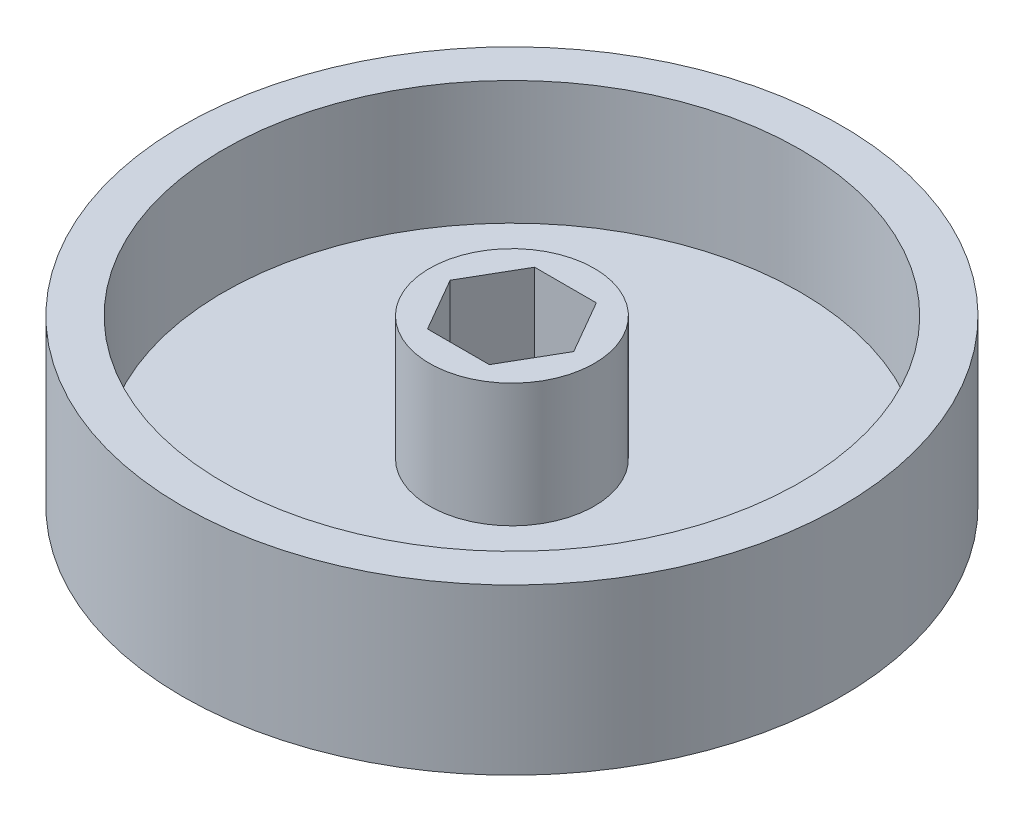
ISO-10303-21;
HEADER;
FILE_DESCRIPTION(('STEP AP214'),'2;1');
FILE_NAME('part.step','',(''),(''),'','','');
FILE_SCHEMA(('AUTOMOTIVE_DESIGN { 1 0 10303 214 1 1 1 1 }'));
ENDSEC;
DATA;
#1=APPLICATION_CONTEXT('core data for automotive mechanical design processes');
#2=APPLICATION_PROTOCOL_DEFINITION('international standard','automotive_design',2000,#1);
#3=PRODUCT_CONTEXT('',#1,'mechanical');
#4=PRODUCT('Part','Part','',(#3));
#5=PRODUCT_RELATED_PRODUCT_CATEGORY('part','',(#4));
#6=PRODUCT_DEFINITION_FORMATION('','',#4);
#7=PRODUCT_DEFINITION_CONTEXT('part definition',#1,'design');
#8=PRODUCT_DEFINITION('design','',#6,#7);
#9=PRODUCT_DEFINITION_SHAPE('','',#8);
#10=(LENGTH_UNIT() NAMED_UNIT(*) SI_UNIT(.MILLI.,.METRE.));
#11=(NAMED_UNIT(*) PLANE_ANGLE_UNIT() SI_UNIT($,.RADIAN.));
#12=(NAMED_UNIT(*) SI_UNIT($,.STERADIAN.) SOLID_ANGLE_UNIT());
#13=UNCERTAINTY_MEASURE_WITH_UNIT(LENGTH_MEASURE(1.E-05),#10,'distance_accuracy_value','');
#14=(GEOMETRIC_REPRESENTATION_CONTEXT(3) GLOBAL_UNCERTAINTY_ASSIGNED_CONTEXT((#13)) GLOBAL_UNIT_ASSIGNED_CONTEXT((#10,
#11,#12)) REPRESENTATION_CONTEXT('',''));
#15=CARTESIAN_POINT('',(0.,0.,0.));
#16=DIRECTION('',(0.,0.,1.));
#17=DIRECTION('',(1.,0.,0.));
#18=AXIS2_PLACEMENT_3D('',#15,#16,#17);
#19=CARTESIAN_POINT('',(0.,6.35,0.));
#20=DIRECTION('',(0.,1.,0.));
#21=DIRECTION('',(0.,0.,1.));
#22=AXIS2_PLACEMENT_3D('',#19,#20,#21);
#23=PLANE('',#22);
#24=CARTESIAN_POINT('',(0.,6.35,0.));
#25=DIRECTION('',(0.,1.,0.));
#26=DIRECTION('',(0.,0.,1.));
#27=AXIS2_PLACEMENT_3D('',#24,#25,#26);
#28=CIRCLE('',#27,44.45);
#29=CARTESIAN_POINT('',(0.,6.35,-44.45));
#30=VERTEX_POINT('',#29);
#31=EDGE_CURVE('E11',#30,#30,#28,.F.);
#32=ORIENTED_EDGE('',*,*,#31,.F.);
#33=EDGE_LOOP('',(#32));
#34=FACE_BOUND('',#33,.T.);
#35=CARTESIAN_POINT('',(0.,6.35,0.));
#36=DIRECTION('',(0.,1.,0.));
#37=DIRECTION('',(0.,0.,1.));
#38=AXIS2_PLACEMENT_3D('',#35,#36,#37);
#39=CIRCLE('',#38,12.7);
#40=CARTESIAN_POINT('',(0.,6.35,-12.7));
#41=VERTEX_POINT('',#40);
#42=EDGE_CURVE('E133',#41,#41,#39,.T.);
#43=ORIENTED_EDGE('',*,*,#42,.F.);
#44=EDGE_LOOP('',(#43));
#45=FACE_BOUND('',#44,.T.);
#46=ADVANCED_FACE('F35',(#34,#45),#23,.T.);
#47=CARTESIAN_POINT('',(0.,6.35,0.));
#48=DIRECTION('',(0.,-1.,0.));
#49=DIRECTION('',(0.,0.,-1.));
#50=AXIS2_PLACEMENT_3D('',#47,#48,#49);
#51=CYLINDRICAL_SURFACE('',#50,50.8);
#52=CARTESIAN_POINT('',(0.,0.,0.));
#53=DIRECTION('',(0.,1.,0.));
#54=DIRECTION('',(0.,0.,1.));
#55=AXIS2_PLACEMENT_3D('',#52,#53,#54);
#56=CIRCLE('',#55,50.8);
#57=CARTESIAN_POINT('',(0.,0.,50.8));
#58=VERTEX_POINT('',#57);
#59=EDGE_CURVE('E43',#58,#58,#56,.T.);
#60=ORIENTED_EDGE('',*,*,#59,.T.);
#61=EDGE_LOOP('',(#60));
#62=FACE_BOUND('',#61,.T.);
#63=CARTESIAN_POINT('',(0.,25.4,0.));
#64=DIRECTION('',(0.,1.,0.));
#65=DIRECTION('',(0.,0.,1.));
#66=AXIS2_PLACEMENT_3D('',#63,#64,#65);
#67=CIRCLE('',#66,50.8);
#68=CARTESIAN_POINT('',(0.,25.4,50.8));
#69=VERTEX_POINT('',#68);
#70=EDGE_CURVE('E149',#69,#69,#67,.T.);
#71=ORIENTED_EDGE('',*,*,#70,.F.);
#72=EDGE_LOOP('',(#71));
#73=FACE_BOUND('',#72,.T.);
#74=ADVANCED_FACE('F37',(#62,#73),#51,.T.);
#75=CARTESIAN_POINT('',(0.,0.,0.));
#76=DIRECTION('',(0.,1.,0.));
#77=DIRECTION('',(0.,0.,1.));
#78=AXIS2_PLACEMENT_3D('',#75,#76,#77);
#79=PLANE('',#78);
#80=DIRECTION('',(0.5,0.,0.866025403784439));
#81=VECTOR('',#80,1.);
#82=CARTESIAN_POINT('',(-7.14375000000001,0.,4.12444598552339));
#83=LINE('',#82,#81);
#84=CARTESIAN_POINT('',(-9.52500000000001,0.,0.));
#85=VERTEX_POINT('',#84);
#86=CARTESIAN_POINT('',(-4.76250000000001,0.,8.24889197104678));
#87=VERTEX_POINT('',#86);
#88=EDGE_CURVE('E96',#85,#87,#83,.T.);
#89=ORIENTED_EDGE('',*,*,#88,.T.);
#90=DIRECTION('',(1.,0.,0.));
#91=VECTOR('',#90,1.);
#92=CARTESIAN_POINT('',(0.,0.,8.24889197104678));
#93=LINE('',#92,#91);
#94=CARTESIAN_POINT('',(4.7625,0.,8.24889197104678));
#95=VERTEX_POINT('',#94);
#96=EDGE_CURVE('E90',#87,#95,#93,.T.);
#97=ORIENTED_EDGE('',*,*,#96,.T.);
#98=DIRECTION('',(0.5,0.,-0.866025403784439));
#99=VECTOR('',#98,1.);
#100=CARTESIAN_POINT('',(7.14375,0.,4.12444598552339));
#101=LINE('',#100,#99);
#102=CARTESIAN_POINT('',(9.525,0.,0.));
#103=VERTEX_POINT('',#102);
#104=EDGE_CURVE('E99',#95,#103,#101,.T.);
#105=ORIENTED_EDGE('',*,*,#104,.T.);
#106=DIRECTION('',(-0.5,0.,-0.866025403784439));
#107=VECTOR('',#106,1.);
#108=CARTESIAN_POINT('',(7.14375,0.,-4.12444598552339));
#109=LINE('',#108,#107);
#110=CARTESIAN_POINT('',(4.7625,0.,-8.24889197104678));
#111=VERTEX_POINT('',#110);
#112=EDGE_CURVE('E50',#103,#111,#109,.T.);
#113=ORIENTED_EDGE('',*,*,#112,.T.);
#114=DIRECTION('',(-1.,0.,0.));
#115=VECTOR('',#114,1.);
#116=CARTESIAN_POINT('',(0.,0.,-8.24889197104678));
#117=LINE('',#116,#115);
#118=CARTESIAN_POINT('',(-4.7625,0.,-8.24889197104678));
#119=VERTEX_POINT('',#118);
#120=EDGE_CURVE('E114',#111,#119,#117,.T.);
#121=ORIENTED_EDGE('',*,*,#120,.T.);
#122=DIRECTION('',(-0.5,0.,0.866025403784439));
#123=VECTOR('',#122,1.);
#124=CARTESIAN_POINT('',(-7.14375000000001,0.,-4.12444598552339));
#125=LINE('',#124,#123);
#126=EDGE_CURVE('E117',#119,#85,#125,.T.);
#127=ORIENTED_EDGE('',*,*,#126,.T.);
#128=EDGE_LOOP('',(#89,#97,#105,#113,#121,#127));
#129=FACE_BOUND('',#128,.T.);
#130=ORIENTED_EDGE('',*,*,#59,.F.);
#131=EDGE_LOOP('',(#130));
#132=FACE_BOUND('',#131,.T.);
#133=ADVANCED_FACE('F103',(#129,#132),#79,.F.);
#134=CARTESIAN_POINT('',(0.,25.4,0.));
#135=DIRECTION('',(0.,1.,0.));
#136=DIRECTION('',(0.,0.,1.));
#137=AXIS2_PLACEMENT_3D('',#134,#135,#136);
#138=PLANE('',#137);
#139=ORIENTED_EDGE('',*,*,#70,.T.);
#140=EDGE_LOOP('',(#139));
#141=FACE_BOUND('',#140,.T.);
#142=CARTESIAN_POINT('',(0.,25.4,0.));
#143=DIRECTION('',(0.,1.,0.));
#144=DIRECTION('',(0.,0.,1.));
#145=AXIS2_PLACEMENT_3D('',#142,#143,#144);
#146=CIRCLE('',#145,44.45);
#147=CARTESIAN_POINT('',(0.,25.4,-44.45));
#148=VERTEX_POINT('',#147);
#149=EDGE_CURVE('E144',#148,#148,#146,.T.);
#150=ORIENTED_EDGE('',*,*,#149,.F.);
#151=EDGE_LOOP('',(#150));
#152=FACE_BOUND('',#151,.T.);
#153=ADVANCED_FACE('F156',(#141,#152),#138,.T.);
#154=CARTESIAN_POINT('',(0.,25.4,0.));
#155=DIRECTION('',(0.,-1.,0.));
#156=DIRECTION('',(0.,0.,-1.));
#157=AXIS2_PLACEMENT_3D('',#154,#155,#156);
#158=CYLINDRICAL_SURFACE('',#157,44.45);
#159=CARTESIAN_POINT('',(0.,25.4,-44.45));
#160=CARTESIAN_POINT('',(0.,25.2015625,-44.45));
#161=CARTESIAN_POINT('',(0.,25.003125,-44.45));
#162=CARTESIAN_POINT('',(0.,24.60625,-44.45));
#163=CARTESIAN_POINT('',(0.,24.4078125,-44.45));
#164=CARTESIAN_POINT('',(0.,24.0109375,-44.45));
#165=CARTESIAN_POINT('',(0.,23.8125,-44.45));
#166=CARTESIAN_POINT('',(0.,23.415625,-44.45));
#167=CARTESIAN_POINT('',(0.,23.2171875,-44.45));
#168=CARTESIAN_POINT('',(0.,22.8203125,-44.45));
#169=CARTESIAN_POINT('',(0.,22.621875,-44.45));
#170=CARTESIAN_POINT('',(0.,22.225,-44.45));
#171=CARTESIAN_POINT('',(0.,22.0265625,-44.45));
#172=CARTESIAN_POINT('',(0.,21.6296875,-44.45));
#173=CARTESIAN_POINT('',(0.,21.43125,-44.45));
#174=CARTESIAN_POINT('',(0.,21.034375,-44.45));
#175=CARTESIAN_POINT('',(0.,20.8359375,-44.45));
#176=CARTESIAN_POINT('',(0.,20.4390625,-44.45));
#177=CARTESIAN_POINT('',(0.,20.240625,-44.45));
#178=CARTESIAN_POINT('',(0.,19.84375,-44.45));
#179=CARTESIAN_POINT('',(0.,19.6453125,-44.45));
#180=CARTESIAN_POINT('',(0.,19.2484375,-44.45));
#181=CARTESIAN_POINT('',(0.,19.05,-44.45));
#182=CARTESIAN_POINT('',(0.,18.653125,-44.45));
#183=CARTESIAN_POINT('',(0.,18.4546875,-44.45));
#184=CARTESIAN_POINT('',(0.,18.0578125,-44.45));
#185=CARTESIAN_POINT('',(0.,17.859375,-44.45));
#186=CARTESIAN_POINT('',(0.,17.4625,-44.45));
#187=CARTESIAN_POINT('',(0.,17.2640625,-44.45));
#188=CARTESIAN_POINT('',(0.,16.8671875,-44.45));
#189=CARTESIAN_POINT('',(0.,16.66875,-44.45));
#190=CARTESIAN_POINT('',(0.,16.271875,-44.45));
#191=CARTESIAN_POINT('',(0.,16.0734375,-44.45));
#192=CARTESIAN_POINT('',(0.,15.6765625,-44.45));
#193=CARTESIAN_POINT('',(0.,15.478125,-44.45));
#194=CARTESIAN_POINT('',(0.,15.08125,-44.45));
#195=CARTESIAN_POINT('',(0.,14.8828125,-44.45));
#196=CARTESIAN_POINT('',(0.,14.4859375,-44.45));
#197=CARTESIAN_POINT('',(0.,14.2875,-44.45));
#198=CARTESIAN_POINT('',(0.,13.890625,-44.45));
#199=CARTESIAN_POINT('',(0.,13.6921875,-44.45));
#200=CARTESIAN_POINT('',(0.,13.2953125,-44.45));
#201=CARTESIAN_POINT('',(0.,13.096875,-44.45));
#202=CARTESIAN_POINT('',(0.,12.7,-44.45));
#203=CARTESIAN_POINT('',(0.,12.5015625,-44.45));
#204=CARTESIAN_POINT('',(0.,12.1046875,-44.45));
#205=CARTESIAN_POINT('',(0.,11.90625,-44.45));
#206=CARTESIAN_POINT('',(0.,11.509375,-44.45));
#207=CARTESIAN_POINT('',(0.,11.3109375,-44.45));
#208=CARTESIAN_POINT('',(0.,10.9140625,-44.45));
#209=CARTESIAN_POINT('',(0.,10.715625,-44.45));
#210=CARTESIAN_POINT('',(0.,10.31875,-44.45));
#211=CARTESIAN_POINT('',(0.,10.1203125,-44.45));
#212=CARTESIAN_POINT('',(0.,9.7234375,-44.45));
#213=CARTESIAN_POINT('',(0.,9.525,-44.45));
#214=CARTESIAN_POINT('',(0.,9.128125,-44.45));
#215=CARTESIAN_POINT('',(0.,8.9296875,-44.45));
#216=CARTESIAN_POINT('',(0.,8.5328125,-44.45));
#217=CARTESIAN_POINT('',(0.,8.334375,-44.45));
#218=CARTESIAN_POINT('',(0.,7.9375,-44.45));
#219=CARTESIAN_POINT('',(0.,7.7390625,-44.45));
#220=CARTESIAN_POINT('',(0.,7.3421875,-44.45));
#221=CARTESIAN_POINT('',(0.,7.14375,-44.45));
#222=CARTESIAN_POINT('',(0.,6.746875,-44.45));
#223=CARTESIAN_POINT('',(0.,6.5484375,-44.45));
#224=CARTESIAN_POINT('',(0.,6.35,-44.45));
#225=B_SPLINE_CURVE_WITH_KNOTS('',3,(#159,#160,#161,#162,#163,#164,#165,#166,#167,#168,#169,
#170,#171,#172,#173,#174,#175,#176,#177,#178,#179,#180,#181,#182,#183,#184,#185,#186,#187,#188,
#189,#190,#191,#192,#193,#194,#195,#196,#197,#198,#199,#200,#201,#202,#203,#204,#205,#206,#207,
#208,#209,#210,#211,#212,#213,#214,#215,#216,#217,#218,#219,#220,#221,#222,#223,#224),
.UNSPECIFIED.,.F.,.F.,(4,2,2,2,2,2,2,2,2,2,2,2,2,2,2,2,2,2,2,2,2,2,2,2,2,2,2,2,2,2,2,2,4),(0.,
0.595312499999997,1.190625,1.7859375,2.38125,2.9765625,3.571875,4.1671875,4.7625,5.3578125,
5.953125,6.5484375,7.14375,7.7390625,8.33437499999999,8.92968749999999,9.525,10.1203125,
10.715625,11.3109375,11.90625,12.5015625,13.096875,13.6921875,14.2875,14.8828125,15.478125,
16.0734375,16.66875,17.2640625,17.859375,18.4546875,19.05),.UNSPECIFIED.);
#226=EDGE_CURVE('BSEAM161',#148,#30,#225,.T.);
#227=ORIENTED_EDGE('',*,*,#149,.T.);
#228=ORIENTED_EDGE('',*,*,#31,.T.);
#229=ORIENTED_EDGE('',*,*,#226,.T.);
#230=ORIENTED_EDGE('',*,*,#226,.F.);
#231=EDGE_LOOP('',(#227,#229,#228,#230));
#232=FACE_BOUND('',#231,.T.);
#233=ADVANCED_FACE('F161',(#232),#158,.F.);
#234=CARTESIAN_POINT('',(0.,25.4,0.));
#235=DIRECTION('',(0.,-1.,0.));
#236=DIRECTION('',(0.,0.,-1.));
#237=AXIS2_PLACEMENT_3D('',#234,#235,#236);
#238=CYLINDRICAL_SURFACE('',#237,12.7);
#239=CARTESIAN_POINT('',(0.,25.4,0.));
#240=DIRECTION('',(0.,1.,0.));
#241=DIRECTION('',(0.,0.,1.));
#242=AXIS2_PLACEMENT_3D('',#239,#240,#241);
#243=CIRCLE('',#242,12.7);
#244=CARTESIAN_POINT('',(0.,25.4,-12.7));
#245=VERTEX_POINT('',#244);
#246=EDGE_CURVE('E141',#245,#245,#243,.T.);
#247=CARTESIAN_POINT('',(0.,25.4,-12.7));
#248=CARTESIAN_POINT('',(0.,25.2015625,-12.7));
#249=CARTESIAN_POINT('',(0.,25.003125,-12.7));
#250=CARTESIAN_POINT('',(0.,24.60625,-12.7));
#251=CARTESIAN_POINT('',(0.,24.4078125,-12.7));
#252=CARTESIAN_POINT('',(0.,24.0109375,-12.7));
#253=CARTESIAN_POINT('',(0.,23.8125,-12.7));
#254=CARTESIAN_POINT('',(0.,23.415625,-12.7));
#255=CARTESIAN_POINT('',(0.,23.2171875,-12.7));
#256=CARTESIAN_POINT('',(0.,22.8203125,-12.7));
#257=CARTESIAN_POINT('',(0.,22.621875,-12.7));
#258=CARTESIAN_POINT('',(0.,22.225,-12.7));
#259=CARTESIAN_POINT('',(0.,22.0265625,-12.7));
#260=CARTESIAN_POINT('',(0.,21.6296875,-12.7));
#261=CARTESIAN_POINT('',(0.,21.43125,-12.7));
#262=CARTESIAN_POINT('',(0.,21.034375,-12.7));
#263=CARTESIAN_POINT('',(0.,20.8359375,-12.7));
#264=CARTESIAN_POINT('',(0.,20.4390625,-12.7));
#265=CARTESIAN_POINT('',(0.,20.240625,-12.7));
#266=CARTESIAN_POINT('',(0.,19.84375,-12.7));
#267=CARTESIAN_POINT('',(0.,19.6453125,-12.7));
#268=CARTESIAN_POINT('',(0.,19.2484375,-12.7));
#269=CARTESIAN_POINT('',(0.,19.05,-12.7));
#270=CARTESIAN_POINT('',(0.,18.653125,-12.7));
#271=CARTESIAN_POINT('',(0.,18.4546875,-12.7));
#272=CARTESIAN_POINT('',(0.,18.0578125,-12.7));
#273=CARTESIAN_POINT('',(0.,17.859375,-12.7));
#274=CARTESIAN_POINT('',(0.,17.4625,-12.7));
#275=CARTESIAN_POINT('',(0.,17.2640625,-12.7));
#276=CARTESIAN_POINT('',(0.,16.8671875,-12.7));
#277=CARTESIAN_POINT('',(0.,16.66875,-12.7));
#278=CARTESIAN_POINT('',(0.,16.271875,-12.7));
#279=CARTESIAN_POINT('',(0.,16.0734375,-12.7));
#280=CARTESIAN_POINT('',(0.,15.6765625,-12.7));
#281=CARTESIAN_POINT('',(0.,15.478125,-12.7));
#282=CARTESIAN_POINT('',(0.,15.08125,-12.7));
#283=CARTESIAN_POINT('',(0.,14.8828125,-12.7));
#284=CARTESIAN_POINT('',(0.,14.4859375,-12.7));
#285=CARTESIAN_POINT('',(0.,14.2875,-12.7));
#286=CARTESIAN_POINT('',(0.,13.890625,-12.7));
#287=CARTESIAN_POINT('',(0.,13.6921875,-12.7));
#288=CARTESIAN_POINT('',(0.,13.2953125,-12.7));
#289=CARTESIAN_POINT('',(0.,13.096875,-12.7));
#290=CARTESIAN_POINT('',(0.,12.7,-12.7));
#291=CARTESIAN_POINT('',(0.,12.5015625,-12.7));
#292=CARTESIAN_POINT('',(0.,12.1046875,-12.7));
#293=CARTESIAN_POINT('',(0.,11.90625,-12.7));
#294=CARTESIAN_POINT('',(0.,11.509375,-12.7));
#295=CARTESIAN_POINT('',(0.,11.3109375,-12.7));
#296=CARTESIAN_POINT('',(0.,10.9140625,-12.7));
#297=CARTESIAN_POINT('',(0.,10.715625,-12.7));
#298=CARTESIAN_POINT('',(0.,10.31875,-12.7));
#299=CARTESIAN_POINT('',(0.,10.1203125,-12.7));
#300=CARTESIAN_POINT('',(0.,9.7234375,-12.7));
#301=CARTESIAN_POINT('',(0.,9.525,-12.7));
#302=CARTESIAN_POINT('',(0.,9.128125,-12.7));
#303=CARTESIAN_POINT('',(0.,8.9296875,-12.7));
#304=CARTESIAN_POINT('',(0.,8.5328125,-12.7));
#305=CARTESIAN_POINT('',(0.,8.334375,-12.7));
#306=CARTESIAN_POINT('',(0.,7.9375,-12.7));
#307=CARTESIAN_POINT('',(0.,7.7390625,-12.7));
#308=CARTESIAN_POINT('',(0.,7.3421875,-12.7));
#309=CARTESIAN_POINT('',(0.,7.14375,-12.7));
#310=CARTESIAN_POINT('',(0.,6.746875,-12.7));
#311=CARTESIAN_POINT('',(0.,6.5484375,-12.7));
#312=CARTESIAN_POINT('',(0.,6.35,-12.7));
#313=B_SPLINE_CURVE_WITH_KNOTS('',3,(#247,#248,#249,#250,#251,#252,#253,#254,#255,#256,#257,
#258,#259,#260,#261,#262,#263,#264,#265,#266,#267,#268,#269,#270,#271,#272,#273,#274,#275,#276,
#277,#278,#279,#280,#281,#282,#283,#284,#285,#286,#287,#288,#289,#290,#291,#292,#293,#294,#295,
#296,#297,#298,#299,#300,#301,#302,#303,#304,#305,#306,#307,#308,#309,#310,#311,#312),
.UNSPECIFIED.,.F.,.F.,(4,2,2,2,2,2,2,2,2,2,2,2,2,2,2,2,2,2,2,2,2,2,2,2,2,2,2,2,2,2,2,2,4),(0.,
0.5953125,1.190625,1.7859375,2.38125,2.9765625,3.571875,4.1671875,4.7625,5.3578125,5.953125,
6.5484375,7.14375,7.7390625,8.334375,8.9296875,9.525,10.1203125,10.715625,11.3109375,11.90625,
12.5015625,13.096875,13.6921875,14.2875,14.8828125,15.478125,16.0734375,16.66875,17.2640625,
17.859375,18.4546875,19.05),.UNSPECIFIED.);
#314=EDGE_CURVE('BSEAM174',#245,#41,#313,.T.);
#315=ORIENTED_EDGE('',*,*,#246,.F.);
#316=ORIENTED_EDGE('',*,*,#42,.T.);
#317=ORIENTED_EDGE('',*,*,#314,.T.);
#318=ORIENTED_EDGE('',*,*,#314,.F.);
#319=EDGE_LOOP('',(#315,#317,#316,#318));
#320=FACE_BOUND('',#319,.T.);
#321=ADVANCED_FACE('F174',(#320),#238,.T.);
#322=CARTESIAN_POINT('',(0.,25.4,0.));
#323=DIRECTION('',(0.,1.,0.));
#324=DIRECTION('',(0.,0.,1.));
#325=AXIS2_PLACEMENT_3D('',#322,#323,#324);
#326=PLANE('',#325);
#327=DIRECTION('',(1.,0.,0.));
#328=VECTOR('',#327,1.);
#329=CARTESIAN_POINT('',(0.,25.4,8.24889197104678));
#330=LINE('',#329,#328);
#331=CARTESIAN_POINT('',(-4.76250000000001,25.4,8.24889197104678));
#332=VERTEX_POINT('',#331);
#333=CARTESIAN_POINT('',(4.7625,25.4,8.24889197104678));
#334=VERTEX_POINT('',#333);
#335=EDGE_CURVE('E58',#332,#334,#330,.T.);
#336=ORIENTED_EDGE('',*,*,#335,.F.);
#337=DIRECTION('',(0.5,0.,0.866025403784439));
#338=VECTOR('',#337,1.);
#339=CARTESIAN_POINT('',(-7.14375000000001,25.4,4.12444598552339));
#340=LINE('',#339,#338);
#341=CARTESIAN_POINT('',(-9.52500000000001,25.4,0.));
#342=VERTEX_POINT('',#341);
#343=EDGE_CURVE('E107',#342,#332,#340,.T.);
#344=ORIENTED_EDGE('',*,*,#343,.F.);
#345=DIRECTION('',(-0.5,0.,0.866025403784439));
#346=VECTOR('',#345,1.);
#347=CARTESIAN_POINT('',(-7.14375000000001,25.4,-4.12444598552339));
#348=LINE('',#347,#346);
#349=CARTESIAN_POINT('',(-4.7625,25.4,-8.24889197104678));
#350=VERTEX_POINT('',#349);
#351=EDGE_CURVE('E110',#350,#342,#348,.T.);
#352=ORIENTED_EDGE('',*,*,#351,.F.);
#353=DIRECTION('',(-1.,0.,0.));
#354=VECTOR('',#353,1.);
#355=CARTESIAN_POINT('',(0.,25.4,-8.24889197104678));
#356=LINE('',#355,#354);
#357=CARTESIAN_POINT('',(4.7625,25.4,-8.24889197104678));
#358=VERTEX_POINT('',#357);
#359=EDGE_CURVE('E126',#358,#350,#356,.T.);
#360=ORIENTED_EDGE('',*,*,#359,.F.);
#361=DIRECTION('',(-0.5,0.,-0.866025403784439));
#362=VECTOR('',#361,1.);
#363=CARTESIAN_POINT('',(7.14375,25.4,-4.12444598552339));
#364=LINE('',#363,#362);
#365=CARTESIAN_POINT('',(9.525,25.4,0.));
#366=VERTEX_POINT('',#365);
#367=EDGE_CURVE('E123',#366,#358,#364,.T.);
#368=ORIENTED_EDGE('',*,*,#367,.F.);
#369=DIRECTION('',(0.5,0.,-0.866025403784439));
#370=VECTOR('',#369,1.);
#371=CARTESIAN_POINT('',(7.14375,25.4,4.12444598552339));
#372=LINE('',#371,#370);
#373=EDGE_CURVE('E121',#334,#366,#372,.T.);
#374=ORIENTED_EDGE('',*,*,#373,.F.);
#375=EDGE_LOOP('',(#336,#344,#352,#360,#368,#374));
#376=FACE_BOUND('',#375,.T.);
#377=ORIENTED_EDGE('',*,*,#246,.T.);
#378=EDGE_LOOP('',(#377));
#379=FACE_BOUND('',#378,.T.);
#380=ADVANCED_FACE('F178',(#376,#379),#326,.T.);
#381=CARTESIAN_POINT('',(0.,0.,8.24889197104678));
#382=DIRECTION('',(0.,0.,1.));
#383=DIRECTION('',(1.,0.,0.));
#384=AXIS2_PLACEMENT_3D('',#381,#382,#383);
#385=PLANE('',#384);
#386=ORIENTED_EDGE('',*,*,#335,.T.);
#387=DIRECTION('',(0.,1.,0.));
#388=VECTOR('',#387,1.);
#389=CARTESIAN_POINT('',(4.7625,0.,8.24889197104678));
#390=LINE('',#389,#388);
#391=EDGE_CURVE('E86',#95,#334,#390,.T.);
#392=ORIENTED_EDGE('',*,*,#391,.F.);
#393=ORIENTED_EDGE('',*,*,#96,.F.);
#394=DIRECTION('',(0.,1.,0.));
#395=VECTOR('',#394,1.);
#396=CARTESIAN_POINT('',(-4.76250000000001,0.,8.24889197104678));
#397=LINE('',#396,#395);
#398=EDGE_CURVE('E131',#87,#332,#397,.T.);
#399=ORIENTED_EDGE('',*,*,#398,.T.);
#400=EDGE_LOOP('',(#386,#392,#393,#399));
#401=FACE_BOUND('',#400,.T.);
#402=ADVANCED_FACE('F88',(#401),#385,.F.);
#403=CARTESIAN_POINT('',(-7.14375000000001,0.,4.12444598552339));
#404=DIRECTION('',(-0.866025403784439,0.,0.5));
#405=DIRECTION('',(0.5,0.,0.866025403784439));
#406=AXIS2_PLACEMENT_3D('',#403,#404,#405);
#407=PLANE('',#406);
#408=ORIENTED_EDGE('',*,*,#343,.T.);
#409=ORIENTED_EDGE('',*,*,#398,.F.);
#410=ORIENTED_EDGE('',*,*,#88,.F.);
#411=DIRECTION('',(0.,1.,0.));
#412=VECTOR('',#411,1.);
#413=CARTESIAN_POINT('',(-9.52500000000001,0.,0.));
#414=LINE('',#413,#412);
#415=EDGE_CURVE('E134',#85,#342,#414,.T.);
#416=ORIENTED_EDGE('',*,*,#415,.T.);
#417=EDGE_LOOP('',(#408,#409,#410,#416));
#418=FACE_BOUND('',#417,.T.);
#419=ADVANCED_FACE('F185',(#418),#407,.F.);
#420=CARTESIAN_POINT('',(-7.14375000000001,0.,-4.12444598552339));
#421=DIRECTION('',(-0.866025403784439,0.,-0.5));
#422=DIRECTION('',(-0.5,0.,0.866025403784439));
#423=AXIS2_PLACEMENT_3D('',#420,#421,#422);
#424=PLANE('',#423);
#425=ORIENTED_EDGE('',*,*,#351,.T.);
#426=ORIENTED_EDGE('',*,*,#415,.F.);
#427=ORIENTED_EDGE('',*,*,#126,.F.);
#428=DIRECTION('',(0.,1.,0.));
#429=VECTOR('',#428,1.);
#430=CARTESIAN_POINT('',(-4.7625,0.,-8.24889197104678));
#431=LINE('',#430,#429);
#432=EDGE_CURVE('E136',#119,#350,#431,.T.);
#433=ORIENTED_EDGE('',*,*,#432,.T.);
#434=EDGE_LOOP('',(#425,#426,#427,#433));
#435=FACE_BOUND('',#434,.T.);
#436=ADVANCED_FACE('F194',(#435),#424,.F.);
#437=CARTESIAN_POINT('',(0.,0.,-8.24889197104678));
#438=DIRECTION('',(0.,0.,-1.));
#439=DIRECTION('',(-1.,0.,0.));
#440=AXIS2_PLACEMENT_3D('',#437,#438,#439);
#441=PLANE('',#440);
#442=ORIENTED_EDGE('',*,*,#359,.T.);
#443=ORIENTED_EDGE('',*,*,#432,.F.);
#444=ORIENTED_EDGE('',*,*,#120,.F.);
#445=DIRECTION('',(0.,1.,0.));
#446=VECTOR('',#445,1.);
#447=CARTESIAN_POINT('',(4.7625,0.,-8.24889197104678));
#448=LINE('',#447,#446);
#449=EDGE_CURVE('E138',#111,#358,#448,.T.);
#450=ORIENTED_EDGE('',*,*,#449,.T.);
#451=EDGE_LOOP('',(#442,#443,#444,#450));
#452=FACE_BOUND('',#451,.T.);
#453=ADVANCED_FACE('F191',(#452),#441,.F.);
#454=CARTESIAN_POINT('',(7.14375,0.,-4.12444598552339));
#455=DIRECTION('',(0.866025403784439,0.,-0.5));
#456=DIRECTION('',(-0.5,0.,-0.866025403784439));
#457=AXIS2_PLACEMENT_3D('',#454,#455,#456);
#458=PLANE('',#457);
#459=ORIENTED_EDGE('',*,*,#367,.T.);
#460=ORIENTED_EDGE('',*,*,#449,.F.);
#461=ORIENTED_EDGE('',*,*,#112,.F.);
#462=DIRECTION('',(0.,1.,0.));
#463=VECTOR('',#462,1.);
#464=CARTESIAN_POINT('',(9.525,0.,0.));
#465=LINE('',#464,#463);
#466=EDGE_CURVE('E95',#103,#366,#465,.T.);
#467=ORIENTED_EDGE('',*,*,#466,.T.);
#468=EDGE_LOOP('',(#459,#460,#461,#467));
#469=FACE_BOUND('',#468,.T.);
#470=ADVANCED_FACE('F188',(#469),#458,.F.);
#471=CARTESIAN_POINT('',(7.14375,0.,4.12444598552339));
#472=DIRECTION('',(0.866025403784439,0.,0.5));
#473=DIRECTION('',(0.5,0.,-0.866025403784439));
#474=AXIS2_PLACEMENT_3D('',#471,#472,#473);
#475=PLANE('',#474);
#476=ORIENTED_EDGE('',*,*,#373,.T.);
#477=ORIENTED_EDGE('',*,*,#466,.F.);
#478=ORIENTED_EDGE('',*,*,#104,.F.);
#479=ORIENTED_EDGE('',*,*,#391,.T.);
#480=EDGE_LOOP('',(#476,#477,#478,#479));
#481=FACE_BOUND('',#480,.T.);
#482=ADVANCED_FACE('F100',(#481),#475,.F.);
#483=CLOSED_SHELL('',(#46,#74,#133,#153,#233,#321,#380,#402,#419,#436,#453,#470,#482));
#484=MANIFOLD_SOLID_BREP('B2',#483);
#485=ADVANCED_BREP_SHAPE_REPRESENTATION('',(#18,#484),#14);
#486=SHAPE_DEFINITION_REPRESENTATION(#9,#485);
ENDSEC;
END-ISO-10303-21;
